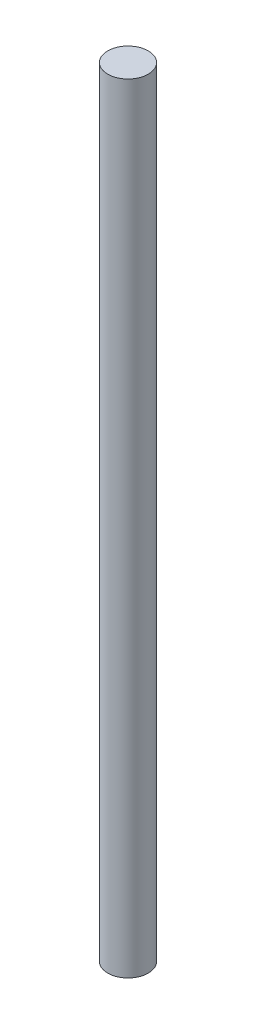
ISO-10303-21;
HEADER;
FILE_DESCRIPTION(('STEP AP214'),'2;1');
FILE_NAME('part.step','',(''),(''),'','','');
FILE_SCHEMA(('AUTOMOTIVE_DESIGN { 1 0 10303 214 1 1 1 1 }'));
ENDSEC;
DATA;
#1=APPLICATION_CONTEXT('core data for automotive mechanical design processes');
#2=APPLICATION_PROTOCOL_DEFINITION('international standard','automotive_design',2000,#1);
#3=PRODUCT_CONTEXT('',#1,'mechanical');
#4=PRODUCT('Part','Part','',(#3));
#5=PRODUCT_RELATED_PRODUCT_CATEGORY('part','',(#4));
#6=PRODUCT_DEFINITION_FORMATION('','',#4);
#7=PRODUCT_DEFINITION_CONTEXT('part definition',#1,'design');
#8=PRODUCT_DEFINITION('design','',#6,#7);
#9=PRODUCT_DEFINITION_SHAPE('','',#8);
#10=(LENGTH_UNIT() NAMED_UNIT(*) SI_UNIT(.MILLI.,.METRE.));
#11=(NAMED_UNIT(*) PLANE_ANGLE_UNIT() SI_UNIT($,.RADIAN.));
#12=(NAMED_UNIT(*) SI_UNIT($,.STERADIAN.) SOLID_ANGLE_UNIT());
#13=UNCERTAINTY_MEASURE_WITH_UNIT(LENGTH_MEASURE(1.E-05),#10,'distance_accuracy_value','');
#14=(GEOMETRIC_REPRESENTATION_CONTEXT(3) GLOBAL_UNCERTAINTY_ASSIGNED_CONTEXT((#13)) GLOBAL_UNIT_ASSIGNED_CONTEXT((#10,
#11,#12)) REPRESENTATION_CONTEXT('',''));
#15=CARTESIAN_POINT('',(0.,0.,0.));
#16=DIRECTION('',(0.,0.,1.));
#17=DIRECTION('',(1.,0.,0.));
#18=AXIS2_PLACEMENT_3D('',#15,#16,#17);
#19=CARTESIAN_POINT('',(0.,481.306000048,0.));
#20=DIRECTION('',(0.,-1.,0.));
#21=DIRECTION('',(0.,0.,-1.));
#22=AXIS2_PLACEMENT_3D('',#19,#20,#21);
#23=CYLINDRICAL_SURFACE('',#22,12.5);
#24=CARTESIAN_POINT('',(0.,481.306000048,0.));
#25=DIRECTION('',(0.,1.,0.));
#26=DIRECTION('',(0.,0.,1.));
#27=AXIS2_PLACEMENT_3D('',#24,#25,#26);
#28=CIRCLE('',#27,12.5);
#29=CARTESIAN_POINT('',(0.,481.306000048,12.5));
#30=VERTEX_POINT('',#29);
#31=EDGE_CURVE('E10',#30,#30,#28,.T.);
#32=ORIENTED_EDGE('',*,*,#31,.F.);
#33=EDGE_LOOP('',(#32));
#34=FACE_BOUND('',#33,.T.);
#35=CARTESIAN_POINT('',(0.,0.,0.));
#36=DIRECTION('',(0.,1.,0.));
#37=DIRECTION('',(0.,0.,1.));
#38=AXIS2_PLACEMENT_3D('',#35,#36,#37);
#39=CIRCLE('',#38,12.5);
#40=CARTESIAN_POINT('',(0.,0.,12.5));
#41=VERTEX_POINT('',#40);
#42=EDGE_CURVE('E40',#41,#41,#39,.T.);
#43=ORIENTED_EDGE('',*,*,#42,.T.);
#44=EDGE_LOOP('',(#43));
#45=FACE_BOUND('',#44,.T.);
#46=ADVANCED_FACE('F37',(#34,#45),#23,.T.);
#47=CARTESIAN_POINT('',(0.,481.306000048,0.));
#48=DIRECTION('',(0.,1.,0.));
#49=DIRECTION('',(0.,0.,1.));
#50=AXIS2_PLACEMENT_3D('',#47,#48,#49);
#51=PLANE('',#50);
#52=ORIENTED_EDGE('',*,*,#31,.T.);
#53=EDGE_LOOP('',(#52));
#54=FACE_BOUND('',#53,.T.);
#55=ADVANCED_FACE('F52',(#54),#51,.T.);
#56=CARTESIAN_POINT('',(0.,0.,0.));
#57=DIRECTION('',(0.,1.,0.));
#58=DIRECTION('',(0.,0.,1.));
#59=AXIS2_PLACEMENT_3D('',#56,#57,#58);
#60=PLANE('',#59);
#61=ORIENTED_EDGE('',*,*,#42,.F.);
#62=EDGE_LOOP('',(#61));
#63=FACE_BOUND('',#62,.T.);
#64=ADVANCED_FACE('F50',(#63),#60,.F.);
#65=CLOSED_SHELL('',(#46,#55,#64));
#66=MANIFOLD_SOLID_BREP('B2',#65);
#67=ADVANCED_BREP_SHAPE_REPRESENTATION('',(#18,#66),#14);
#68=SHAPE_DEFINITION_REPRESENTATION(#9,#67);
ENDSEC;
END-ISO-10303-21;
